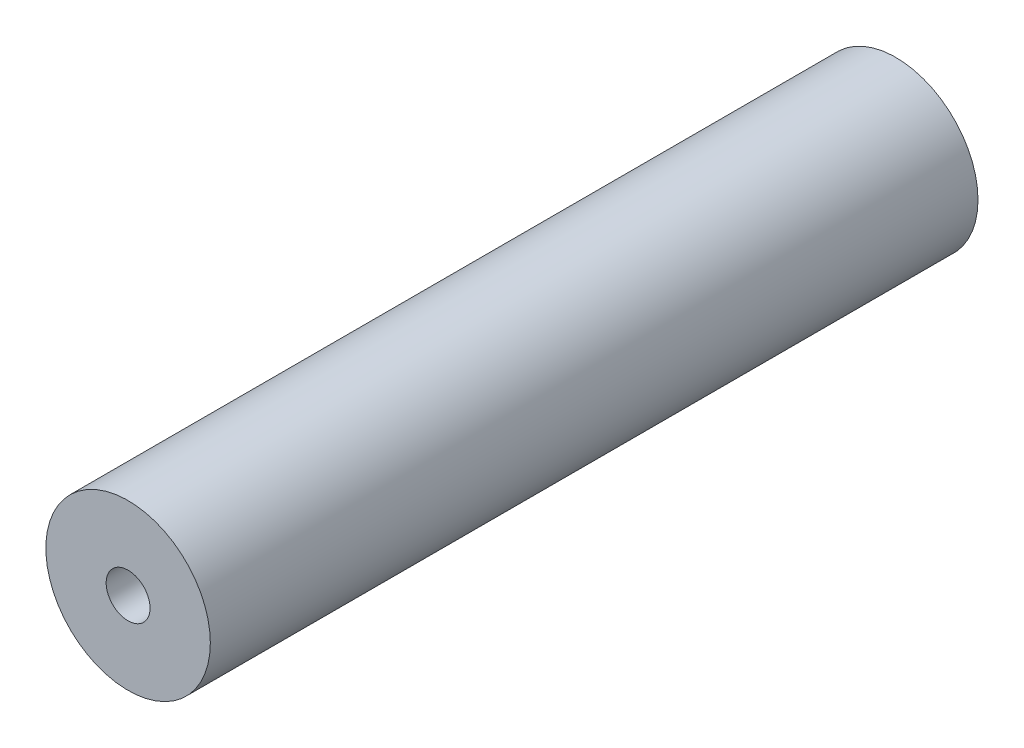
ISO-10303-21;
HEADER;
FILE_DESCRIPTION(('STEP AP214'),'2;1');
FILE_NAME('part.step','',(''),(''),'','','');
FILE_SCHEMA(('AUTOMOTIVE_DESIGN { 1 0 10303 214 1 1 1 1 }'));
ENDSEC;
DATA;
#1=APPLICATION_CONTEXT('core data for automotive mechanical design processes');
#2=APPLICATION_PROTOCOL_DEFINITION('international standard','automotive_design',2000,#1);
#3=PRODUCT_CONTEXT('',#1,'mechanical');
#4=PRODUCT('Part','Part','',(#3));
#5=PRODUCT_RELATED_PRODUCT_CATEGORY('part','',(#4));
#6=PRODUCT_DEFINITION_FORMATION('','',#4);
#7=PRODUCT_DEFINITION_CONTEXT('part definition',#1,'design');
#8=PRODUCT_DEFINITION('design','',#6,#7);
#9=PRODUCT_DEFINITION_SHAPE('','',#8);
#10=(LENGTH_UNIT() NAMED_UNIT(*) SI_UNIT(.MILLI.,.METRE.));
#11=(NAMED_UNIT(*) PLANE_ANGLE_UNIT() SI_UNIT($,.RADIAN.));
#12=(NAMED_UNIT(*) SI_UNIT($,.STERADIAN.) SOLID_ANGLE_UNIT());
#13=UNCERTAINTY_MEASURE_WITH_UNIT(LENGTH_MEASURE(1.E-05),#10,'distance_accuracy_value','');
#14=(GEOMETRIC_REPRESENTATION_CONTEXT(3) GLOBAL_UNCERTAINTY_ASSIGNED_CONTEXT((#13)) GLOBAL_UNIT_ASSIGNED_CONTEXT((#10,
#11,#12)) REPRESENTATION_CONTEXT('',''));
#15=CARTESIAN_POINT('',(0.,0.,0.));
#16=DIRECTION('',(0.,0.,1.));
#17=DIRECTION('',(1.,0.,0.));
#18=AXIS2_PLACEMENT_3D('',#15,#16,#17);
#19=CARTESIAN_POINT('',(0.,0.,44.45));
#20=DIRECTION('',(0.,0.,1.));
#21=DIRECTION('',(1.,0.,0.));
#22=AXIS2_PLACEMENT_3D('',#19,#20,#21);
#23=PLANE('',#22);
#24=CARTESIAN_POINT('',(0.,0.,44.45));
#25=DIRECTION('',(0.,0.,1.));
#26=DIRECTION('',(1.,0.,0.));
#27=AXIS2_PLACEMENT_3D('',#24,#25,#26);
#28=CIRCLE('',#27,4.7625);
#29=CARTESIAN_POINT('',(4.7625,0.,44.45));
#30=VERTEX_POINT('',#29);
#31=EDGE_CURVE('E10',#30,#30,#28,.T.);
#32=ORIENTED_EDGE('',*,*,#31,.T.);
#33=EDGE_LOOP('',(#32));
#34=FACE_BOUND('',#33,.T.);
#35=CARTESIAN_POINT('',(0.,0.,44.45));
#36=DIRECTION('',(0.,0.,1.));
#37=DIRECTION('',(1.,0.,0.));
#38=AXIS2_PLACEMENT_3D('',#35,#36,#37);
#39=CIRCLE('',#38,1.27);
#40=CARTESIAN_POINT('',(1.27,0.,44.45));
#41=VERTEX_POINT('',#40);
#42=EDGE_CURVE('E43',#41,#41,#39,.T.);
#43=ORIENTED_EDGE('',*,*,#42,.F.);
#44=EDGE_LOOP('',(#43));
#45=FACE_BOUND('',#44,.T.);
#46=ADVANCED_FACE('F32',(#34,#45),#23,.T.);
#47=CARTESIAN_POINT('',(0.,0.,0.));
#48=DIRECTION('',(0.,0.,1.));
#49=DIRECTION('',(1.,0.,0.));
#50=AXIS2_PLACEMENT_3D('',#47,#48,#49);
#51=PLANE('',#50);
#52=CARTESIAN_POINT('',(0.,0.,0.));
#53=DIRECTION('',(0.,0.,1.));
#54=DIRECTION('',(1.,0.,0.));
#55=AXIS2_PLACEMENT_3D('',#52,#53,#54);
#56=CIRCLE('',#55,4.7625);
#57=CARTESIAN_POINT('',(4.7625,0.,0.));
#58=VERTEX_POINT('',#57);
#59=EDGE_CURVE('E36',#58,#58,#56,.T.);
#60=ORIENTED_EDGE('',*,*,#59,.F.);
#61=EDGE_LOOP('',(#60));
#62=FACE_BOUND('',#61,.T.);
#63=CARTESIAN_POINT('',(0.,0.,0.));
#64=DIRECTION('',(0.,0.,1.));
#65=DIRECTION('',(1.,0.,0.));
#66=AXIS2_PLACEMENT_3D('',#63,#64,#65);
#67=CIRCLE('',#66,1.27);
#68=CARTESIAN_POINT('',(1.27,0.,0.));
#69=VERTEX_POINT('',#68);
#70=EDGE_CURVE('E45',#69,#69,#67,.T.);
#71=ORIENTED_EDGE('',*,*,#70,.T.);
#72=EDGE_LOOP('',(#71));
#73=FACE_BOUND('',#72,.T.);
#74=ADVANCED_FACE('F55',(#62,#73),#51,.F.);
#75=CARTESIAN_POINT('',(0.,0.,44.45));
#76=DIRECTION('',(0.,0.,-1.));
#77=DIRECTION('',(-1.,0.,0.));
#78=AXIS2_PLACEMENT_3D('',#75,#76,#77);
#79=CYLINDRICAL_SURFACE('',#78,4.7625);
#80=ORIENTED_EDGE('',*,*,#31,.F.);
#81=EDGE_LOOP('',(#80));
#82=FACE_BOUND('',#81,.T.);
#83=ORIENTED_EDGE('',*,*,#59,.T.);
#84=EDGE_LOOP('',(#83));
#85=FACE_BOUND('',#84,.T.);
#86=ADVANCED_FACE('F34',(#82,#85),#79,.T.);
#87=CARTESIAN_POINT('',(0.,0.,44.45));
#88=DIRECTION('',(0.,0.,-1.));
#89=DIRECTION('',(-1.,0.,0.));
#90=AXIS2_PLACEMENT_3D('',#87,#88,#89);
#91=CYLINDRICAL_SURFACE('',#90,1.27);
#92=ORIENTED_EDGE('',*,*,#42,.T.);
#93=EDGE_LOOP('',(#92));
#94=FACE_BOUND('',#93,.T.);
#95=ORIENTED_EDGE('',*,*,#70,.F.);
#96=EDGE_LOOP('',(#95));
#97=FACE_BOUND('',#96,.T.);
#98=ADVANCED_FACE('F51',(#94,#97),#91,.F.);
#99=CLOSED_SHELL('',(#46,#74,#86,#98));
#100=MANIFOLD_SOLID_BREP('B2',#99);
#101=ADVANCED_BREP_SHAPE_REPRESENTATION('',(#18,#100),#14);
#102=SHAPE_DEFINITION_REPRESENTATION(#9,#101);
ENDSEC;
END-ISO-10303-21;
